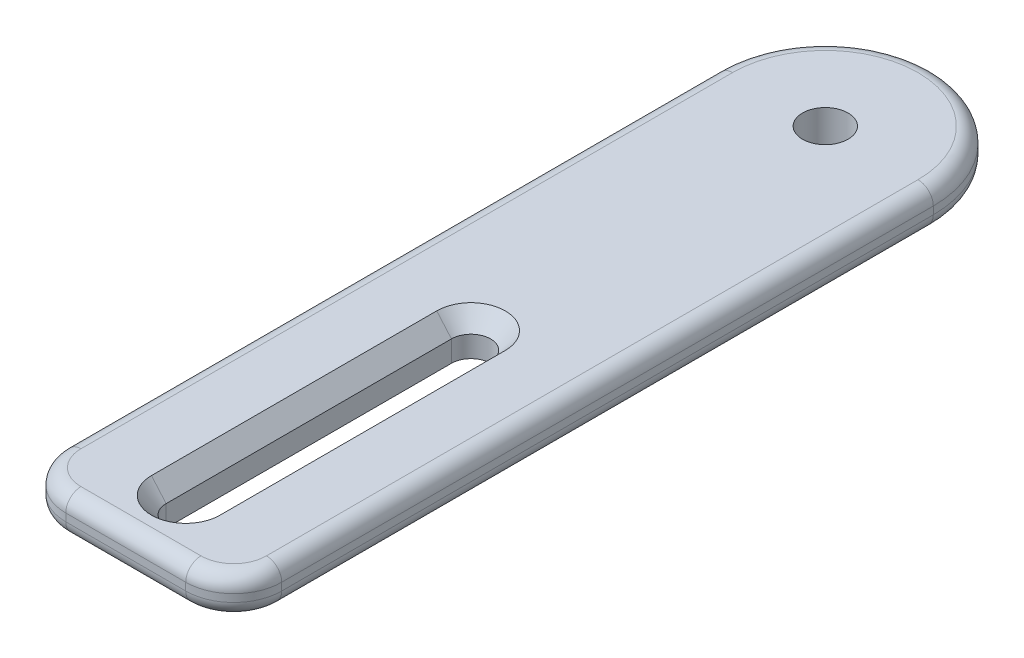
ISO-10303-21;
HEADER;
FILE_DESCRIPTION(('STEP AP214'),'2;1');
FILE_NAME('part.step','',(''),(''),'','','');
FILE_SCHEMA(('AUTOMOTIVE_DESIGN { 1 0 10303 214 1 1 1 1 }'));
ENDSEC;
DATA;
#1=APPLICATION_CONTEXT('core data for automotive mechanical design processes');
#2=APPLICATION_PROTOCOL_DEFINITION('international standard','automotive_design',2000,#1);
#3=PRODUCT_CONTEXT('',#1,'mechanical');
#4=PRODUCT('Part','Part','',(#3));
#5=PRODUCT_RELATED_PRODUCT_CATEGORY('part','',(#4));
#6=PRODUCT_DEFINITION_FORMATION('','',#4);
#7=PRODUCT_DEFINITION_CONTEXT('part definition',#1,'design');
#8=PRODUCT_DEFINITION('design','',#6,#7);
#9=PRODUCT_DEFINITION_SHAPE('','',#8);
#10=(LENGTH_UNIT() NAMED_UNIT(*) SI_UNIT(.MILLI.,.METRE.));
#11=(NAMED_UNIT(*) PLANE_ANGLE_UNIT() SI_UNIT($,.RADIAN.));
#12=(NAMED_UNIT(*) SI_UNIT($,.STERADIAN.) SOLID_ANGLE_UNIT());
#13=UNCERTAINTY_MEASURE_WITH_UNIT(LENGTH_MEASURE(1.E-05),#10,'distance_accuracy_value','');
#14=(GEOMETRIC_REPRESENTATION_CONTEXT(3) GLOBAL_UNCERTAINTY_ASSIGNED_CONTEXT((#13)) GLOBAL_UNIT_ASSIGNED_CONTEXT((#10,
#11,#12)) REPRESENTATION_CONTEXT('',''));
#15=CARTESIAN_POINT('',(0.,0.,0.));
#16=DIRECTION('',(0.,0.,1.));
#17=DIRECTION('',(1.,0.,0.));
#18=AXIS2_PLACEMENT_3D('',#15,#16,#17);
#19=CARTESIAN_POINT('',(10.63195,-3.175,0.));
#20=DIRECTION('',(-1.,0.,0.));
#21=DIRECTION('',(0.,0.,1.));
#22=AXIS2_PLACEMENT_3D('',#19,#20,#21);
#23=PLANE('',#22);
#24=DIRECTION('',(0.,1.,0.));
#25=VECTOR('',#24,1.);
#26=CARTESIAN_POINT('',(10.63195,-3.175,-5.));
#27=LINE('',#26,#25);
#28=CARTESIAN_POINT('',(10.63195,-3.175,-5.));
#29=VERTEX_POINT('',#28);
#30=CARTESIAN_POINT('',(10.63195,-1.4098340014697,-5.));
#31=VERTEX_POINT('',#30);
#32=EDGE_CURVE('E238',#29,#31,#27,.T.);
#33=ORIENTED_EDGE('',*,*,#32,.T.);
#34=DIRECTION('',(0.,0.,1.));
#35=VECTOR('',#34,1.);
#36=CARTESIAN_POINT('',(10.63195,-1.4098340014697,0.));
#37=LINE('',#36,#35);
#38=CARTESIAN_POINT('',(10.63195,-1.4098340014697,-28.78));
#39=VERTEX_POINT('',#38);
#40=EDGE_CURVE('E199',#31,#39,#37,.F.);
#41=ORIENTED_EDGE('',*,*,#40,.T.);
#42=DIRECTION('',(0.,1.,0.));
#43=VECTOR('',#42,1.);
#44=CARTESIAN_POINT('',(10.63195,-3.175,-28.78));
#45=LINE('',#44,#43);
#46=CARTESIAN_POINT('',(10.63195,-3.175,-28.78));
#47=VERTEX_POINT('',#46);
#48=EDGE_CURVE('E241',#47,#39,#45,.T.);
#49=ORIENTED_EDGE('',*,*,#48,.F.);
#50=DIRECTION('',(0.,0.,1.));
#51=VECTOR('',#50,1.);
#52=CARTESIAN_POINT('',(10.63195,-3.175,0.));
#53=LINE('',#52,#51);
#54=EDGE_CURVE('E210',#47,#29,#53,.T.);
#55=ORIENTED_EDGE('',*,*,#54,.T.);
#56=EDGE_LOOP('',(#33,#41,#49,#55));
#57=FACE_BOUND('',#56,.T.);
#58=ADVANCED_FACE('F34',(#57),#23,.T.);
#59=CARTESIAN_POINT('',(9.,-3.175,-58.31));
#60=DIRECTION('',(0.,1.,0.));
#61=DIRECTION('',(0.,0.,1.));
#62=AXIS2_PLACEMENT_3D('',#59,#60,#61);
#63=CYLINDRICAL_SURFACE('',#62,9.);
#64=DIRECTION('',(0.,1.,0.));
#65=VECTOR('',#64,1.);
#66=CARTESIAN_POINT('',(18.,-3.175,-58.31));
#67=LINE('',#66,#65);
#68=CARTESIAN_POINT('',(18.,-1.905,-58.31));
#69=VERTEX_POINT('',#68);
#70=CARTESIAN_POINT('',(18.,-1.27,-58.31));
#71=VERTEX_POINT('',#70);
#72=EDGE_CURVE('E216',#69,#71,#67,.T.);
#73=ORIENTED_EDGE('',*,*,#72,.F.);
#74=CARTESIAN_POINT('',(9.,-1.905,-58.31));
#75=DIRECTION('',(0.,1.,0.));
#76=DIRECTION('',(0.,0.,1.));
#77=AXIS2_PLACEMENT_3D('',#74,#75,#76);
#78=CIRCLE('',#77,9.);
#79=CARTESIAN_POINT('',(0.,-1.905,-58.31));
#80=VERTEX_POINT('',#79);
#81=EDGE_CURVE('E248',#69,#80,#78,.T.);
#82=ORIENTED_EDGE('',*,*,#81,.T.);
#83=DIRECTION('',(0.,1.,0.));
#84=VECTOR('',#83,1.);
#85=CARTESIAN_POINT('',(0.,-3.175,-58.31));
#86=LINE('',#85,#84);
#87=CARTESIAN_POINT('',(0.,-1.27,-58.31));
#88=VERTEX_POINT('',#87);
#89=EDGE_CURVE('E232',#80,#88,#86,.T.);
#90=ORIENTED_EDGE('',*,*,#89,.T.);
#91=CARTESIAN_POINT('',(9.,-1.27,-58.31));
#92=DIRECTION('',(0.,1.,0.));
#93=DIRECTION('',(0.,0.,1.));
#94=AXIS2_PLACEMENT_3D('',#91,#92,#93);
#95=CIRCLE('',#94,9.);
#96=EDGE_CURVE('E219',#88,#71,#95,.F.);
#97=ORIENTED_EDGE('',*,*,#96,.T.);
#98=EDGE_LOOP('',(#73,#82,#90,#97));
#99=FACE_BOUND('',#98,.T.);
#100=ADVANCED_FACE('F384',(#99),#63,.T.);
#101=CARTESIAN_POINT('',(18.,-3.175,0.));
#102=DIRECTION('',(-1.,0.,0.));
#103=DIRECTION('',(0.,0.,1.));
#104=AXIS2_PLACEMENT_3D('',#101,#102,#103);
#105=PLANE('',#104);
#106=DIRECTION('',(0.,1.,0.));
#107=VECTOR('',#106,1.);
#108=CARTESIAN_POINT('',(18.,-3.175,-4.));
#109=LINE('',#108,#107);
#110=CARTESIAN_POINT('',(18.,-1.905,-4.));
#111=VERTEX_POINT('',#110);
#112=CARTESIAN_POINT('',(18.,-1.27,-4.));
#113=VERTEX_POINT('',#112);
#114=EDGE_CURVE('E220',#111,#113,#109,.T.);
#115=ORIENTED_EDGE('',*,*,#114,.F.);
#116=DIRECTION('',(0.,0.,1.));
#117=VECTOR('',#116,1.);
#118=CARTESIAN_POINT('',(18.,-1.905,0.));
#119=LINE('',#118,#117);
#120=EDGE_CURVE('E11',#111,#69,#119,.F.);
#121=ORIENTED_EDGE('',*,*,#120,.T.);
#122=ORIENTED_EDGE('',*,*,#72,.T.);
#123=DIRECTION('',(0.,0.,1.));
#124=VECTOR('',#123,1.);
#125=CARTESIAN_POINT('',(18.,-1.27,-4.));
#126=LINE('',#125,#124);
#127=EDGE_CURVE('E43',#71,#113,#126,.T.);
#128=ORIENTED_EDGE('',*,*,#127,.T.);
#129=EDGE_LOOP('',(#115,#121,#122,#128));
#130=FACE_BOUND('',#129,.T.);
#131=ADVANCED_FACE('F376',(#130),#105,.F.);
#132=CARTESIAN_POINT('',(14.,-3.175,-4.));
#133=DIRECTION('',(0.,1.,0.));
#134=DIRECTION('',(0.,0.,1.));
#135=AXIS2_PLACEMENT_3D('',#132,#133,#134);
#136=CYLINDRICAL_SURFACE('',#135,4.);
#137=DIRECTION('',(0.,1.,0.));
#138=VECTOR('',#137,1.);
#139=CARTESIAN_POINT('',(14.,-3.175,0.));
#140=LINE('',#139,#138);
#141=CARTESIAN_POINT('',(14.,-1.905,0.));
#142=VERTEX_POINT('',#141);
#143=CARTESIAN_POINT('',(14.,-1.27,0.));
#144=VERTEX_POINT('',#143);
#145=EDGE_CURVE('E223',#142,#144,#140,.T.);
#146=ORIENTED_EDGE('',*,*,#145,.F.);
#147=CARTESIAN_POINT('',(14.,-1.905,-4.));
#148=DIRECTION('',(0.,1.,0.));
#149=DIRECTION('',(0.,0.,1.));
#150=AXIS2_PLACEMENT_3D('',#147,#148,#149);
#151=CIRCLE('',#150,4.);
#152=EDGE_CURVE('E278',#142,#111,#151,.T.);
#153=ORIENTED_EDGE('',*,*,#152,.T.);
#154=ORIENTED_EDGE('',*,*,#114,.T.);
#155=CARTESIAN_POINT('',(14.,-1.27,-4.));
#156=DIRECTION('',(0.,1.,0.));
#157=DIRECTION('',(0.,0.,1.));
#158=AXIS2_PLACEMENT_3D('',#155,#156,#157);
#159=CIRCLE('',#158,4.);
#160=EDGE_CURVE('E276',#113,#144,#159,.F.);
#161=ORIENTED_EDGE('',*,*,#160,.T.);
#162=EDGE_LOOP('',(#146,#153,#154,#161));
#163=FACE_BOUND('',#162,.T.);
#164=ADVANCED_FACE('F373',(#163),#136,.T.);
#165=CARTESIAN_POINT('',(0.,-3.175,0.));
#166=DIRECTION('',(0.,0.,1.));
#167=DIRECTION('',(1.,0.,0.));
#168=AXIS2_PLACEMENT_3D('',#165,#166,#167);
#169=PLANE('',#168);
#170=DIRECTION('',(0.,1.,0.));
#171=VECTOR('',#170,1.);
#172=CARTESIAN_POINT('',(3.99999999999999,-3.175,0.));
#173=LINE('',#172,#171);
#174=CARTESIAN_POINT('',(3.99999999999999,-1.905,0.));
#175=VERTEX_POINT('',#174);
#176=CARTESIAN_POINT('',(3.99999999999999,-1.27,0.));
#177=VERTEX_POINT('',#176);
#178=EDGE_CURVE('E226',#175,#177,#173,.T.);
#179=ORIENTED_EDGE('',*,*,#178,.F.);
#180=DIRECTION('',(1.,0.,0.));
#181=VECTOR('',#180,1.);
#182=CARTESIAN_POINT('',(14.,-1.905,0.));
#183=LINE('',#182,#181);
#184=EDGE_CURVE('E274',#175,#142,#183,.T.);
#185=ORIENTED_EDGE('',*,*,#184,.T.);
#186=ORIENTED_EDGE('',*,*,#145,.T.);
#187=DIRECTION('',(1.,0.,0.));
#188=VECTOR('',#187,1.);
#189=CARTESIAN_POINT('',(0.,-1.27,0.));
#190=LINE('',#189,#188);
#191=EDGE_CURVE('E272',#144,#177,#190,.F.);
#192=ORIENTED_EDGE('',*,*,#191,.T.);
#193=EDGE_LOOP('',(#179,#185,#186,#192));
#194=FACE_BOUND('',#193,.T.);
#195=ADVANCED_FACE('F334',(#194),#169,.T.);
#196=CARTESIAN_POINT('',(3.99999999999999,-3.175,-4.));
#197=DIRECTION('',(0.,1.,0.));
#198=DIRECTION('',(0.,0.,1.));
#199=AXIS2_PLACEMENT_3D('',#196,#197,#198);
#200=CYLINDRICAL_SURFACE('',#199,4.);
#201=DIRECTION('',(0.,1.,0.));
#202=VECTOR('',#201,1.);
#203=CARTESIAN_POINT('',(0.,-3.175,-4.));
#204=LINE('',#203,#202);
#205=CARTESIAN_POINT('',(0.,-1.905,-4.));
#206=VERTEX_POINT('',#205);
#207=CARTESIAN_POINT('',(0.,-1.27,-4.));
#208=VERTEX_POINT('',#207);
#209=EDGE_CURVE('E229',#206,#208,#204,.T.);
#210=ORIENTED_EDGE('',*,*,#209,.F.);
#211=CARTESIAN_POINT('',(3.99999999999999,-1.905,-4.));
#212=DIRECTION('',(0.,1.,0.));
#213=DIRECTION('',(0.,0.,1.));
#214=AXIS2_PLACEMENT_3D('',#211,#212,#213);
#215=CIRCLE('',#214,4.);
#216=EDGE_CURVE('E270',#206,#175,#215,.T.);
#217=ORIENTED_EDGE('',*,*,#216,.T.);
#218=ORIENTED_EDGE('',*,*,#178,.T.);
#219=CARTESIAN_POINT('',(3.99999999999999,-1.27,-4.));
#220=DIRECTION('',(0.,1.,0.));
#221=DIRECTION('',(0.,0.,1.));
#222=AXIS2_PLACEMENT_3D('',#219,#220,#221);
#223=CIRCLE('',#222,4.);
#224=EDGE_CURVE('E268',#177,#208,#223,.F.);
#225=ORIENTED_EDGE('',*,*,#224,.T.);
#226=EDGE_LOOP('',(#210,#217,#218,#225));
#227=FACE_BOUND('',#226,.T.);
#228=ADVANCED_FACE('F339',(#227),#200,.T.);
#229=CARTESIAN_POINT('',(7.36805000000001,-3.175,0.));
#230=DIRECTION('',(-1.,0.,0.));
#231=DIRECTION('',(0.,0.,1.));
#232=AXIS2_PLACEMENT_3D('',#229,#230,#231);
#233=PLANE('',#232);
#234=DIRECTION('',(0.,1.,0.));
#235=VECTOR('',#234,1.);
#236=CARTESIAN_POINT('',(7.36805,-3.175,-28.78));
#237=LINE('',#236,#235);
#238=CARTESIAN_POINT('',(7.36805,-3.175,-28.78));
#239=VERTEX_POINT('',#238);
#240=CARTESIAN_POINT('',(7.36805,-1.4098340014697,-28.78));
#241=VERTEX_POINT('',#240);
#242=EDGE_CURVE('E215',#239,#241,#237,.T.);
#243=ORIENTED_EDGE('',*,*,#242,.T.);
#244=DIRECTION('',(0.,0.,1.));
#245=VECTOR('',#244,1.);
#246=CARTESIAN_POINT('',(7.36805000000001,-1.4098340014697,0.));
#247=LINE('',#246,#245);
#248=CARTESIAN_POINT('',(7.36805000000001,-1.4098340014697,-5.00000000000001));
#249=VERTEX_POINT('',#248);
#250=EDGE_CURVE('E194',#241,#249,#247,.T.);
#251=ORIENTED_EDGE('',*,*,#250,.T.);
#252=DIRECTION('',(0.,1.,0.));
#253=VECTOR('',#252,1.);
#254=CARTESIAN_POINT('',(7.36805000000001,-3.175,-5.));
#255=LINE('',#254,#253);
#256=CARTESIAN_POINT('',(7.36805000000001,-3.175,-5.));
#257=VERTEX_POINT('',#256);
#258=EDGE_CURVE('E235',#257,#249,#255,.T.);
#259=ORIENTED_EDGE('',*,*,#258,.F.);
#260=DIRECTION('',(0.,0.,1.));
#261=VECTOR('',#260,1.);
#262=CARTESIAN_POINT('',(7.36805000000001,-3.175,0.));
#263=LINE('',#262,#261);
#264=EDGE_CURVE('E205',#239,#257,#263,.T.);
#265=ORIENTED_EDGE('',*,*,#264,.F.);
#266=EDGE_LOOP('',(#243,#251,#259,#265));
#267=FACE_BOUND('',#266,.T.);
#268=ADVANCED_FACE('F415',(#267),#233,.F.);
#269=CARTESIAN_POINT('',(9.00000000000001,-3.175,-5.));
#270=DIRECTION('',(0.,1.,0.));
#271=DIRECTION('',(0.,0.,1.));
#272=AXIS2_PLACEMENT_3D('',#269,#270,#271);
#273=CYLINDRICAL_SURFACE('',#272,1.63195);
#274=ORIENTED_EDGE('',*,*,#258,.T.);
#275=CARTESIAN_POINT('',(9.00000000000001,-1.4098340014697,-5.));
#276=DIRECTION('',(0.,1.,0.));
#277=DIRECTION('',(0.,0.,1.));
#278=AXIS2_PLACEMENT_3D('',#275,#276,#277);
#279=CIRCLE('',#278,1.63195);
#280=EDGE_CURVE('E170',#249,#31,#279,.T.);
#281=ORIENTED_EDGE('',*,*,#280,.T.);
#282=ORIENTED_EDGE('',*,*,#32,.F.);
#283=CARTESIAN_POINT('',(9.00000000000001,-3.175,-5.));
#284=DIRECTION('',(0.,1.,0.));
#285=DIRECTION('',(0.,0.,1.));
#286=AXIS2_PLACEMENT_3D('',#283,#284,#285);
#287=CIRCLE('',#286,1.63195);
#288=EDGE_CURVE('E213',#257,#29,#287,.T.);
#289=ORIENTED_EDGE('',*,*,#288,.F.);
#290=EDGE_LOOP('',(#274,#281,#282,#289));
#291=FACE_BOUND('',#290,.T.);
#292=ADVANCED_FACE('F409',(#291),#273,.F.);
#293=CARTESIAN_POINT('',(9.00000000000001,-3.175,-28.78));
#294=DIRECTION('',(0.,1.,0.));
#295=DIRECTION('',(0.,0.,1.));
#296=AXIS2_PLACEMENT_3D('',#293,#294,#295);
#297=CYLINDRICAL_SURFACE('',#296,1.63195000000001);
#298=ORIENTED_EDGE('',*,*,#48,.T.);
#299=CARTESIAN_POINT('',(9.00000000000001,-1.4098340014697,-28.78));
#300=DIRECTION('',(0.,1.,0.));
#301=DIRECTION('',(0.,0.,1.));
#302=AXIS2_PLACEMENT_3D('',#299,#300,#301);
#303=CIRCLE('',#302,1.63195000000001);
#304=EDGE_CURVE('E202',#39,#241,#303,.T.);
#305=ORIENTED_EDGE('',*,*,#304,.T.);
#306=ORIENTED_EDGE('',*,*,#242,.F.);
#307=CARTESIAN_POINT('',(9.00000000000001,-3.175,-28.78));
#308=DIRECTION('',(0.,1.,0.));
#309=DIRECTION('',(0.,0.,1.));
#310=AXIS2_PLACEMENT_3D('',#307,#308,#309);
#311=CIRCLE('',#310,1.63195000000001);
#312=EDGE_CURVE('E208',#47,#239,#311,.T.);
#313=ORIENTED_EDGE('',*,*,#312,.F.);
#314=EDGE_LOOP('',(#298,#305,#306,#313));
#315=FACE_BOUND('',#314,.T.);
#316=ADVANCED_FACE('F410',(#315),#297,.F.);
#317=CARTESIAN_POINT('',(0.,-3.175,0.));
#318=DIRECTION('',(-1.,0.,0.));
#319=DIRECTION('',(0.,0.,1.));
#320=AXIS2_PLACEMENT_3D('',#317,#318,#319);
#321=PLANE('',#320);
#322=ORIENTED_EDGE('',*,*,#89,.F.);
#323=DIRECTION('',(0.,0.,1.));
#324=VECTOR('',#323,1.);
#325=CARTESIAN_POINT('',(0.,-1.905,-4.));
#326=LINE('',#325,#324);
#327=EDGE_CURVE('E266',#80,#206,#326,.T.);
#328=ORIENTED_EDGE('',*,*,#327,.T.);
#329=ORIENTED_EDGE('',*,*,#209,.T.);
#330=DIRECTION('',(0.,0.,1.));
#331=VECTOR('',#330,1.);
#332=CARTESIAN_POINT('',(0.,-1.27,0.));
#333=LINE('',#332,#331);
#334=EDGE_CURVE('E264',#208,#88,#333,.F.);
#335=ORIENTED_EDGE('',*,*,#334,.T.);
#336=EDGE_LOOP('',(#322,#328,#329,#335));
#337=FACE_BOUND('',#336,.T.);
#338=ADVANCED_FACE('F413',(#337),#321,.T.);
#339=CARTESIAN_POINT('',(0.,-3.175,0.));
#340=DIRECTION('',(0.,1.,0.));
#341=DIRECTION('',(0.,0.,1.));
#342=AXIS2_PLACEMENT_3D('',#339,#340,#341);
#343=PLANE('',#342);
#344=DIRECTION('',(0.,0.,1.));
#345=VECTOR('',#344,1.);
#346=CARTESIAN_POINT('',(1.27000000000001,-3.175,-58.31));
#347=LINE('',#346,#345);
#348=CARTESIAN_POINT('',(1.26999999999999,-3.175,-4.));
#349=VERTEX_POINT('',#348);
#350=CARTESIAN_POINT('',(1.27000000000001,-3.175,-58.31));
#351=VERTEX_POINT('',#350);
#352=EDGE_CURVE('E259',#349,#351,#347,.F.);
#353=ORIENTED_EDGE('',*,*,#352,.T.);
#354=CARTESIAN_POINT('',(9.,-3.175,-58.31));
#355=DIRECTION('',(0.,1.,0.));
#356=DIRECTION('',(0.,0.,1.));
#357=AXIS2_PLACEMENT_3D('',#354,#355,#356);
#358=CIRCLE('',#357,7.73);
#359=CARTESIAN_POINT('',(16.73,-3.175,-58.31));
#360=VERTEX_POINT('',#359);
#361=EDGE_CURVE('E261',#351,#360,#358,.F.);
#362=ORIENTED_EDGE('',*,*,#361,.T.);
#363=DIRECTION('',(0.,0.,1.));
#364=VECTOR('',#363,1.);
#365=CARTESIAN_POINT('',(16.73,-3.175,0.));
#366=LINE('',#365,#364);
#367=CARTESIAN_POINT('',(16.73,-3.175,-4.));
#368=VERTEX_POINT('',#367);
#369=EDGE_CURVE('E251',#360,#368,#366,.T.);
#370=ORIENTED_EDGE('',*,*,#369,.T.);
#371=CARTESIAN_POINT('',(14.,-3.175,-4.));
#372=DIRECTION('',(0.,1.,0.));
#373=DIRECTION('',(0.,0.,1.));
#374=AXIS2_PLACEMENT_3D('',#371,#372,#373);
#375=CIRCLE('',#374,2.73);
#376=CARTESIAN_POINT('',(14.,-3.175,-1.27));
#377=VERTEX_POINT('',#376);
#378=EDGE_CURVE('E253',#368,#377,#375,.F.);
#379=ORIENTED_EDGE('',*,*,#378,.T.);
#380=DIRECTION('',(1.,0.,0.));
#381=VECTOR('',#380,1.);
#382=CARTESIAN_POINT('',(3.99999999999999,-3.175,-1.27));
#383=LINE('',#382,#381);
#384=CARTESIAN_POINT('',(3.99999999999999,-3.175,-1.27));
#385=VERTEX_POINT('',#384);
#386=EDGE_CURVE('E255',#377,#385,#383,.F.);
#387=ORIENTED_EDGE('',*,*,#386,.T.);
#388=CARTESIAN_POINT('',(3.99999999999999,-3.175,-4.));
#389=DIRECTION('',(0.,1.,0.));
#390=DIRECTION('',(0.,0.,1.));
#391=AXIS2_PLACEMENT_3D('',#388,#389,#390);
#392=CIRCLE('',#391,2.73);
#393=EDGE_CURVE('E257',#385,#349,#392,.F.);
#394=ORIENTED_EDGE('',*,*,#393,.T.);
#395=EDGE_LOOP('',(#353,#362,#370,#379,#387,#394));
#396=FACE_BOUND('',#395,.T.);
#397=CARTESIAN_POINT('',(9.,-3.175,-58.31));
#398=DIRECTION('',(0.,1.,0.));
#399=DIRECTION('',(0.,0.,1.));
#400=AXIS2_PLACEMENT_3D('',#397,#398,#399);
#401=CIRCLE('',#400,1.89865);
#402=CARTESIAN_POINT('',(9.,-3.175,-56.41135));
#403=VERTEX_POINT('',#402);
#404=EDGE_CURVE('E640',#403,#403,#401,.T.);
#405=ORIENTED_EDGE('',*,*,#404,.T.);
#406=EDGE_LOOP('',(#405));
#407=FACE_BOUND('',#406,.T.);
#408=ORIENTED_EDGE('',*,*,#264,.T.);
#409=ORIENTED_EDGE('',*,*,#288,.T.);
#410=ORIENTED_EDGE('',*,*,#54,.F.);
#411=ORIENTED_EDGE('',*,*,#312,.T.);
#412=EDGE_LOOP('',(#408,#409,#410,#411));
#413=FACE_BOUND('',#412,.T.);
#414=ADVANCED_FACE('F353',(#396,#407,#413),#343,.F.);
#415=CARTESIAN_POINT('',(0.,0.,0.));
#416=DIRECTION('',(0.,1.,0.));
#417=DIRECTION('',(0.,0.,1.));
#418=AXIS2_PLACEMENT_3D('',#415,#416,#417);
#419=PLANE('',#418);
#420=DIRECTION('',(0.,0.,1.));
#421=VECTOR('',#420,1.);
#422=CARTESIAN_POINT('',(16.73,0.,-58.31));
#423=LINE('',#422,#421);
#424=CARTESIAN_POINT('',(16.73,0.,-4.));
#425=VERTEX_POINT('',#424);
#426=CARTESIAN_POINT('',(16.73,0.,-58.31));
#427=VERTEX_POINT('',#426);
#428=EDGE_CURVE('E280',#425,#427,#423,.F.);
#429=ORIENTED_EDGE('',*,*,#428,.T.);
#430=CARTESIAN_POINT('',(9.,0.,-58.31));
#431=DIRECTION('',(0.,1.,0.));
#432=DIRECTION('',(0.,0.,1.));
#433=AXIS2_PLACEMENT_3D('',#430,#431,#432);
#434=CIRCLE('',#433,7.73);
#435=CARTESIAN_POINT('',(1.27000000000001,0.,-58.31));
#436=VERTEX_POINT('',#435);
#437=EDGE_CURVE('E289',#427,#436,#434,.T.);
#438=ORIENTED_EDGE('',*,*,#437,.T.);
#439=DIRECTION('',(0.,0.,1.));
#440=VECTOR('',#439,1.);
#441=CARTESIAN_POINT('',(1.26999999999999,0.,0.));
#442=LINE('',#441,#440);
#443=CARTESIAN_POINT('',(1.26999999999999,0.,-4.));
#444=VERTEX_POINT('',#443);
#445=EDGE_CURVE('E58',#436,#444,#442,.T.);
#446=ORIENTED_EDGE('',*,*,#445,.T.);
#447=CARTESIAN_POINT('',(3.99999999999999,0.,-4.));
#448=DIRECTION('',(0.,1.,0.));
#449=DIRECTION('',(0.,0.,1.));
#450=AXIS2_PLACEMENT_3D('',#447,#448,#449);
#451=CIRCLE('',#450,2.73);
#452=CARTESIAN_POINT('',(3.99999999999999,0.,-1.27));
#453=VERTEX_POINT('',#452);
#454=EDGE_CURVE('E286',#444,#453,#451,.T.);
#455=ORIENTED_EDGE('',*,*,#454,.T.);
#456=DIRECTION('',(1.,0.,0.));
#457=VECTOR('',#456,1.);
#458=CARTESIAN_POINT('',(0.,0.,-1.27));
#459=LINE('',#458,#457);
#460=CARTESIAN_POINT('',(14.,0.,-1.27));
#461=VERTEX_POINT('',#460);
#462=EDGE_CURVE('E284',#453,#461,#459,.T.);
#463=ORIENTED_EDGE('',*,*,#462,.T.);
#464=CARTESIAN_POINT('',(14.,0.,-4.));
#465=DIRECTION('',(0.,1.,0.));
#466=DIRECTION('',(0.,0.,1.));
#467=AXIS2_PLACEMENT_3D('',#464,#465,#466);
#468=CIRCLE('',#467,2.73);
#469=EDGE_CURVE('E282',#461,#425,#468,.T.);
#470=ORIENTED_EDGE('',*,*,#469,.T.);
#471=EDGE_LOOP('',(#429,#438,#446,#455,#463,#470));
#472=FACE_BOUND('',#471,.T.);
#473=CARTESIAN_POINT('',(9.,0.,-58.31));
#474=DIRECTION('',(0.,1.,0.));
#475=DIRECTION('',(0.,0.,1.));
#476=AXIS2_PLACEMENT_3D('',#473,#474,#475);
#477=CIRCLE('',#476,1.89864999999999);
#478=CARTESIAN_POINT('',(9.,0.,-56.41135));
#479=VERTEX_POINT('',#478);
#480=EDGE_CURVE('E308',#479,#479,#477,.T.);
#481=ORIENTED_EDGE('',*,*,#480,.F.);
#482=EDGE_LOOP('',(#481));
#483=FACE_BOUND('',#482,.T.);
#484=CARTESIAN_POINT('',(9.00000000000001,0.,-28.78));
#485=DIRECTION('',(0.,1.,0.));
#486=DIRECTION('',(0.,0.,1.));
#487=AXIS2_PLACEMENT_3D('',#484,#485,#486);
#488=CIRCLE('',#487,2.85750000000001);
#489=CARTESIAN_POINT('',(11.8575,0.,-28.78));
#490=VERTEX_POINT('',#489);
#491=CARTESIAN_POINT('',(6.1425,0.,-28.78));
#492=VERTEX_POINT('',#491);
#493=EDGE_CURVE('E183',#490,#492,#488,.T.);
#494=ORIENTED_EDGE('',*,*,#493,.F.);
#495=DIRECTION('',(0.,0.,1.));
#496=VECTOR('',#495,1.);
#497=CARTESIAN_POINT('',(11.8575,0.,-28.78));
#498=LINE('',#497,#496);
#499=CARTESIAN_POINT('',(11.8575,0.,-5.));
#500=VERTEX_POINT('',#499);
#501=EDGE_CURVE('E187',#490,#500,#498,.T.);
#502=ORIENTED_EDGE('',*,*,#501,.T.);
#503=CARTESIAN_POINT('',(9.00000000000001,0.,-5.));
#504=DIRECTION('',(0.,1.,0.));
#505=DIRECTION('',(0.,0.,1.));
#506=AXIS2_PLACEMENT_3D('',#503,#504,#505);
#507=CIRCLE('',#506,2.8575);
#508=CARTESIAN_POINT('',(6.14250000000001,0.,-5.00000000000001));
#509=VERTEX_POINT('',#508);
#510=EDGE_CURVE('E167',#509,#500,#507,.T.);
#511=ORIENTED_EDGE('',*,*,#510,.F.);
#512=DIRECTION('',(0.,0.,1.));
#513=VECTOR('',#512,1.);
#514=CARTESIAN_POINT('',(6.1425,0.,-28.78));
#515=LINE('',#514,#513);
#516=EDGE_CURVE('E179',#492,#509,#515,.T.);
#517=ORIENTED_EDGE('',*,*,#516,.F.);
#518=EDGE_LOOP('',(#494,#502,#511,#517));
#519=FACE_BOUND('',#518,.T.);
#520=ADVANCED_FACE('F185',(#472,#483,#519),#419,.T.);
#521=CARTESIAN_POINT('',(9.00000000000001,0.,-28.78));
#522=DIRECTION('',(0.,1.,0.));
#523=DIRECTION('',(0.,0.,1.));
#524=AXIS2_PLACEMENT_3D('',#521,#522,#523);
#525=CONICAL_SURFACE('',#524,2.85750000000001,0.715584993317677);
#526=DIRECTION('',(0.656059028990508,0.754709580222771,0.));
#527=VECTOR('',#526,1.);
#528=CARTESIAN_POINT('',(11.8575,0.,-28.78));
#529=LINE('',#528,#527);
#530=EDGE_CURVE('E192',#39,#490,#529,.T.);
#531=ORIENTED_EDGE('',*,*,#530,.T.);
#532=ORIENTED_EDGE('',*,*,#493,.T.);
#533=DIRECTION('',(-0.656059028990508,0.754709580222771,0.));
#534=VECTOR('',#533,1.);
#535=CARTESIAN_POINT('',(6.1425,0.,-28.78));
#536=LINE('',#535,#534);
#537=EDGE_CURVE('E175',#241,#492,#536,.T.);
#538=ORIENTED_EDGE('',*,*,#537,.F.);
#539=ORIENTED_EDGE('',*,*,#304,.F.);
#540=EDGE_LOOP('',(#531,#532,#538,#539));
#541=FACE_BOUND('',#540,.T.);
#542=ADVANCED_FACE('F530',(#541),#525,.F.);
#543=CARTESIAN_POINT('',(9.00000000000001,0.,-5.));
#544=DIRECTION('',(0.,1.,0.));
#545=DIRECTION('',(0.,0.,1.));
#546=AXIS2_PLACEMENT_3D('',#543,#544,#545);
#547=CONICAL_SURFACE('',#546,2.8575,0.715584993317677);
#548=DIRECTION('',(-0.656059028990508,0.754709580222771,0.));
#549=VECTOR('',#548,1.);
#550=CARTESIAN_POINT('',(6.14250000000001,0.,-5.));
#551=LINE('',#550,#549);
#552=EDGE_CURVE('E162',#249,#509,#551,.T.);
#553=ORIENTED_EDGE('',*,*,#552,.T.);
#554=ORIENTED_EDGE('',*,*,#510,.T.);
#555=DIRECTION('',(0.656059028990508,0.754709580222771,0.));
#556=VECTOR('',#555,1.);
#557=CARTESIAN_POINT('',(11.8575,0.,-5.));
#558=LINE('',#557,#556);
#559=EDGE_CURVE('E174',#31,#500,#558,.T.);
#560=ORIENTED_EDGE('',*,*,#559,.F.);
#561=ORIENTED_EDGE('',*,*,#280,.F.);
#562=EDGE_LOOP('',(#553,#554,#560,#561));
#563=FACE_BOUND('',#562,.T.);
#564=ADVANCED_FACE('F164',(#563),#547,.F.);
#565=CARTESIAN_POINT('',(6.1425,0.,-28.78));
#566=DIRECTION('',(-0.754709580222771,-0.656059028990508,0.));
#567=DIRECTION('',(0.656059028990508,-0.754709580222771,0.));
#568=AXIS2_PLACEMENT_3D('',#565,#566,#567);
#569=PLANE('',#568);
#570=ORIENTED_EDGE('',*,*,#537,.T.);
#571=ORIENTED_EDGE('',*,*,#516,.T.);
#572=ORIENTED_EDGE('',*,*,#552,.F.);
#573=ORIENTED_EDGE('',*,*,#250,.F.);
#574=EDGE_LOOP('',(#570,#571,#572,#573));
#575=FACE_BOUND('',#574,.T.);
#576=ADVANCED_FACE('F180',(#575),#569,.F.);
#577=CARTESIAN_POINT('',(11.8575,0.,-28.78));
#578=DIRECTION('',(0.754709580222771,-0.656059028990508,0.));
#579=DIRECTION('',(0.656059028990508,0.754709580222771,0.));
#580=AXIS2_PLACEMENT_3D('',#577,#578,#579);
#581=PLANE('',#580);
#582=ORIENTED_EDGE('',*,*,#559,.T.);
#583=ORIENTED_EDGE('',*,*,#501,.F.);
#584=ORIENTED_EDGE('',*,*,#530,.F.);
#585=ORIENTED_EDGE('',*,*,#40,.F.);
#586=EDGE_LOOP('',(#582,#583,#584,#585));
#587=FACE_BOUND('',#586,.T.);
#588=ADVANCED_FACE('F505',(#587),#581,.F.);
#589=CARTESIAN_POINT('',(9.,0.,-58.31));
#590=DIRECTION('',(0.,1.,0.));
#591=DIRECTION('',(0.,0.,1.));
#592=AXIS2_PLACEMENT_3D('',#589,#590,#591);
#593=CYLINDRICAL_SURFACE('',#592,1.89864999999999);
#594=ORIENTED_EDGE('',*,*,#404,.F.);
#595=EDGE_LOOP('',(#594));
#596=FACE_BOUND('',#595,.T.);
#597=ORIENTED_EDGE('',*,*,#480,.T.);
#598=EDGE_LOOP('',(#597));
#599=FACE_BOUND('',#598,.T.);
#600=ADVANCED_FACE('F431',(#596,#599),#593,.F.);
#601=CARTESIAN_POINT('',(0.,-1.905,-1.27));
#602=DIRECTION('',(-1.,0.,0.));
#603=DIRECTION('',(0.,0.,1.));
#604=AXIS2_PLACEMENT_3D('',#601,#602,#603);
#605=CYLINDRICAL_SURFACE('',#604,1.27);
#606=CARTESIAN_POINT('',(3.99999999999999,-1.905,-1.27));
#607=DIRECTION('',(-1.,0.,0.));
#608=DIRECTION('',(0.,0.,1.));
#609=AXIS2_PLACEMENT_3D('',#606,#607,#608);
#610=CIRCLE('',#609,1.27);
#611=EDGE_CURVE('E302',#385,#175,#610,.T.);
#612=ORIENTED_EDGE('',*,*,#611,.F.);
#613=ORIENTED_EDGE('',*,*,#386,.F.);
#614=CARTESIAN_POINT('',(14.,-1.905,-1.27));
#615=DIRECTION('',(1.,0.,0.));
#616=DIRECTION('',(0.,0.,-1.));
#617=AXIS2_PLACEMENT_3D('',#614,#615,#616);
#618=CIRCLE('',#617,1.27);
#619=EDGE_CURVE('E305',#142,#377,#618,.T.);
#620=ORIENTED_EDGE('',*,*,#619,.F.);
#621=ORIENTED_EDGE('',*,*,#184,.F.);
#622=EDGE_LOOP('',(#612,#613,#620,#621));
#623=FACE_BOUND('',#622,.T.);
#624=ADVANCED_FACE('F371',(#623),#605,.T.);
#625=CARTESIAN_POINT('',(14.,-1.905,-4.));
#626=DIRECTION('',(0.,1.,0.));
#627=DIRECTION('',(0.,0.,1.));
#628=AXIS2_PLACEMENT_3D('',#625,#626,#627);
#629=TOROIDAL_SURFACE('',#628,2.73,1.27);
#630=ORIENTED_EDGE('',*,*,#619,.T.);
#631=ORIENTED_EDGE('',*,*,#378,.F.);
#632=CARTESIAN_POINT('',(16.73,-1.905,-4.));
#633=DIRECTION('',(0.,0.,-1.));
#634=DIRECTION('',(-1.,0.,0.));
#635=AXIS2_PLACEMENT_3D('',#632,#633,#634);
#636=CIRCLE('',#635,1.27);
#637=EDGE_CURVE('E299',#111,#368,#636,.T.);
#638=ORIENTED_EDGE('',*,*,#637,.F.);
#639=ORIENTED_EDGE('',*,*,#152,.F.);
#640=EDGE_LOOP('',(#630,#631,#638,#639));
#641=FACE_BOUND('',#640,.T.);
#642=ADVANCED_FACE('F367',(#641),#629,.T.);
#643=CARTESIAN_POINT('',(3.99999999999999,-1.905,-4.));
#644=DIRECTION('',(0.,1.,0.));
#645=DIRECTION('',(0.,0.,1.));
#646=AXIS2_PLACEMENT_3D('',#643,#644,#645);
#647=TOROIDAL_SURFACE('',#646,2.73,1.27);
#648=ORIENTED_EDGE('',*,*,#611,.T.);
#649=ORIENTED_EDGE('',*,*,#216,.F.);
#650=CARTESIAN_POINT('',(1.26999999999999,-1.905,-4.));
#651=DIRECTION('',(0.,0.,-1.));
#652=DIRECTION('',(-1.,0.,0.));
#653=AXIS2_PLACEMENT_3D('',#650,#651,#652);
#654=CIRCLE('',#653,1.27);
#655=EDGE_CURVE('E296',#349,#206,#654,.T.);
#656=ORIENTED_EDGE('',*,*,#655,.F.);
#657=ORIENTED_EDGE('',*,*,#393,.F.);
#658=EDGE_LOOP('',(#648,#649,#656,#657));
#659=FACE_BOUND('',#658,.T.);
#660=ADVANCED_FACE('F343',(#659),#647,.T.);
#661=CARTESIAN_POINT('',(16.73,-1.905,0.));
#662=DIRECTION('',(0.,0.,1.));
#663=DIRECTION('',(1.,0.,0.));
#664=AXIS2_PLACEMENT_3D('',#661,#662,#663);
#665=CYLINDRICAL_SURFACE('',#664,1.27);
#666=ORIENTED_EDGE('',*,*,#637,.T.);
#667=ORIENTED_EDGE('',*,*,#369,.F.);
#668=CARTESIAN_POINT('',(16.73,-1.905,-58.31));
#669=DIRECTION('',(0.,0.,-1.));
#670=DIRECTION('',(-1.,0.,0.));
#671=AXIS2_PLACEMENT_3D('',#668,#669,#670);
#672=CIRCLE('',#671,1.27);
#673=EDGE_CURVE('E294',#69,#360,#672,.T.);
#674=ORIENTED_EDGE('',*,*,#673,.F.);
#675=ORIENTED_EDGE('',*,*,#120,.F.);
#676=EDGE_LOOP('',(#666,#667,#674,#675));
#677=FACE_BOUND('',#676,.T.);
#678=ADVANCED_FACE('F362',(#677),#665,.T.);
#679=CARTESIAN_POINT('',(1.26999999999999,-1.905,0.));
#680=DIRECTION('',(0.,0.,-1.));
#681=DIRECTION('',(-1.,0.,0.));
#682=AXIS2_PLACEMENT_3D('',#679,#680,#681);
#683=CYLINDRICAL_SURFACE('',#682,1.27);
#684=ORIENTED_EDGE('',*,*,#655,.T.);
#685=ORIENTED_EDGE('',*,*,#327,.F.);
#686=CARTESIAN_POINT('',(1.27000000000001,-1.905,-58.31));
#687=DIRECTION('',(0.,0.,-1.));
#688=DIRECTION('',(-1.,0.,0.));
#689=AXIS2_PLACEMENT_3D('',#686,#687,#688);
#690=CIRCLE('',#689,1.27);
#691=EDGE_CURVE('E292',#351,#80,#690,.T.);
#692=ORIENTED_EDGE('',*,*,#691,.F.);
#693=ORIENTED_EDGE('',*,*,#352,.F.);
#694=EDGE_LOOP('',(#684,#685,#692,#693));
#695=FACE_BOUND('',#694,.T.);
#696=ADVANCED_FACE('F349',(#695),#683,.T.);
#697=CARTESIAN_POINT('',(9.,-1.905,-58.31));
#698=DIRECTION('',(0.,1.,0.));
#699=DIRECTION('',(0.,0.,1.));
#700=AXIS2_PLACEMENT_3D('',#697,#698,#699);
#701=TOROIDAL_SURFACE('',#700,7.73,1.27);
#702=ORIENTED_EDGE('',*,*,#673,.T.);
#703=ORIENTED_EDGE('',*,*,#361,.F.);
#704=ORIENTED_EDGE('',*,*,#691,.T.);
#705=ORIENTED_EDGE('',*,*,#81,.F.);
#706=EDGE_LOOP('',(#702,#703,#704,#705));
#707=FACE_BOUND('',#706,.T.);
#708=ADVANCED_FACE('F356',(#707),#701,.T.);
#709=CARTESIAN_POINT('',(0.,-1.27,-1.27));
#710=DIRECTION('',(1.,0.,0.));
#711=DIRECTION('',(0.,0.,-1.));
#712=AXIS2_PLACEMENT_3D('',#709,#710,#711);
#713=CYLINDRICAL_SURFACE('',#712,1.27);
#714=CARTESIAN_POINT('',(3.99999999999999,-1.27,-1.27));
#715=DIRECTION('',(-1.,0.,0.));
#716=DIRECTION('',(0.,0.,1.));
#717=AXIS2_PLACEMENT_3D('',#714,#715,#716);
#718=CIRCLE('',#717,1.27);
#719=EDGE_CURVE('E317',#177,#453,#718,.T.);
#720=ORIENTED_EDGE('',*,*,#719,.F.);
#721=ORIENTED_EDGE('',*,*,#191,.F.);
#722=CARTESIAN_POINT('',(14.,-1.27,-1.27));
#723=DIRECTION('',(1.,0.,0.));
#724=DIRECTION('',(0.,0.,-1.));
#725=AXIS2_PLACEMENT_3D('',#722,#723,#724);
#726=CIRCLE('',#725,1.27);
#727=EDGE_CURVE('E38',#461,#144,#726,.T.);
#728=ORIENTED_EDGE('',*,*,#727,.F.);
#729=ORIENTED_EDGE('',*,*,#462,.F.);
#730=EDGE_LOOP('',(#720,#721,#728,#729));
#731=FACE_BOUND('',#730,.T.);
#732=ADVANCED_FACE('F36',(#731),#713,.T.);
#733=CARTESIAN_POINT('',(14.,-1.27,-4.));
#734=DIRECTION('',(0.,1.,0.));
#735=DIRECTION('',(0.,0.,1.));
#736=AXIS2_PLACEMENT_3D('',#733,#734,#735);
#737=TOROIDAL_SURFACE('',#736,2.73,1.27);
#738=ORIENTED_EDGE('',*,*,#727,.T.);
#739=ORIENTED_EDGE('',*,*,#160,.F.);
#740=CARTESIAN_POINT('',(16.73,-1.27,-4.));
#741=DIRECTION('',(0.,0.,-1.));
#742=DIRECTION('',(-1.,0.,0.));
#743=AXIS2_PLACEMENT_3D('',#740,#741,#742);
#744=CIRCLE('',#743,1.27);
#745=EDGE_CURVE('E315',#425,#113,#744,.T.);
#746=ORIENTED_EDGE('',*,*,#745,.F.);
#747=ORIENTED_EDGE('',*,*,#469,.F.);
#748=EDGE_LOOP('',(#738,#739,#746,#747));
#749=FACE_BOUND('',#748,.T.);
#750=ADVANCED_FACE('F327',(#749),#737,.T.);
#751=CARTESIAN_POINT('',(3.99999999999999,-1.27,-4.));
#752=DIRECTION('',(0.,1.,0.));
#753=DIRECTION('',(0.,0.,1.));
#754=AXIS2_PLACEMENT_3D('',#751,#752,#753);
#755=TOROIDAL_SURFACE('',#754,2.73,1.27);
#756=ORIENTED_EDGE('',*,*,#719,.T.);
#757=ORIENTED_EDGE('',*,*,#454,.F.);
#758=CARTESIAN_POINT('',(1.26999999999999,-1.27,-4.));
#759=DIRECTION('',(0.,0.,-1.));
#760=DIRECTION('',(-1.,0.,0.));
#761=AXIS2_PLACEMENT_3D('',#758,#759,#760);
#762=CIRCLE('',#761,1.27);
#763=EDGE_CURVE('E312',#208,#444,#762,.T.);
#764=ORIENTED_EDGE('',*,*,#763,.F.);
#765=ORIENTED_EDGE('',*,*,#224,.F.);
#766=EDGE_LOOP('',(#756,#757,#764,#765));
#767=FACE_BOUND('',#766,.T.);
#768=ADVANCED_FACE('F392',(#767),#755,.T.);
#769=CARTESIAN_POINT('',(16.73,-1.27,0.));
#770=DIRECTION('',(0.,0.,-1.));
#771=DIRECTION('',(-1.,0.,0.));
#772=AXIS2_PLACEMENT_3D('',#769,#770,#771);
#773=CYLINDRICAL_SURFACE('',#772,1.27);
#774=ORIENTED_EDGE('',*,*,#745,.T.);
#775=ORIENTED_EDGE('',*,*,#127,.F.);
#776=CARTESIAN_POINT('',(16.73,-1.27,-58.31));
#777=DIRECTION('',(0.,0.,-1.));
#778=DIRECTION('',(-1.,0.,0.));
#779=AXIS2_PLACEMENT_3D('',#776,#777,#778);
#780=CIRCLE('',#779,1.27);
#781=EDGE_CURVE('E310',#427,#71,#780,.T.);
#782=ORIENTED_EDGE('',*,*,#781,.F.);
#783=ORIENTED_EDGE('',*,*,#428,.F.);
#784=EDGE_LOOP('',(#774,#775,#782,#783));
#785=FACE_BOUND('',#784,.T.);
#786=ADVANCED_FACE('F381',(#785),#773,.T.);
#787=CARTESIAN_POINT('',(1.26999999999999,-1.27,0.));
#788=DIRECTION('',(0.,0.,1.));
#789=DIRECTION('',(1.,0.,0.));
#790=AXIS2_PLACEMENT_3D('',#787,#788,#789);
#791=CYLINDRICAL_SURFACE('',#790,1.27);
#792=ORIENTED_EDGE('',*,*,#763,.T.);
#793=ORIENTED_EDGE('',*,*,#445,.F.);
#794=CARTESIAN_POINT('',(1.27000000000001,-1.27,-58.31));
#795=DIRECTION('',(0.,0.,-1.));
#796=DIRECTION('',(-1.,0.,0.));
#797=AXIS2_PLACEMENT_3D('',#794,#795,#796);
#798=CIRCLE('',#797,1.27);
#799=EDGE_CURVE('E51',#88,#436,#798,.T.);
#800=ORIENTED_EDGE('',*,*,#799,.F.);
#801=ORIENTED_EDGE('',*,*,#334,.F.);
#802=EDGE_LOOP('',(#792,#793,#800,#801));
#803=FACE_BOUND('',#802,.T.);
#804=ADVANCED_FACE('F389',(#803),#791,.T.);
#805=CARTESIAN_POINT('',(9.,-1.27,-58.31));
#806=DIRECTION('',(0.,1.,0.));
#807=DIRECTION('',(0.,0.,1.));
#808=AXIS2_PLACEMENT_3D('',#805,#806,#807);
#809=TOROIDAL_SURFACE('',#808,7.73,1.27);
#810=ORIENTED_EDGE('',*,*,#781,.T.);
#811=ORIENTED_EDGE('',*,*,#96,.F.);
#812=ORIENTED_EDGE('',*,*,#799,.T.);
#813=ORIENTED_EDGE('',*,*,#437,.F.);
#814=EDGE_LOOP('',(#810,#811,#812,#813));
#815=FACE_BOUND('',#814,.T.);
#816=ADVANCED_FACE('F386',(#815),#809,.T.);
#817=CLOSED_SHELL('',(#58,#100,#131,#164,#195,#228,#268,#292,#316,#338,#414,#520,#542,#564,#576,
#588,#600,#624,#642,#660,#678,#696,#708,#732,#750,#768,#786,#804,#816));
#818=MANIFOLD_SOLID_BREP('B2',#817);
#819=ADVANCED_BREP_SHAPE_REPRESENTATION('',(#18,#818),#14);
#820=SHAPE_DEFINITION_REPRESENTATION(#9,#819);
ENDSEC;
END-ISO-10303-21;
